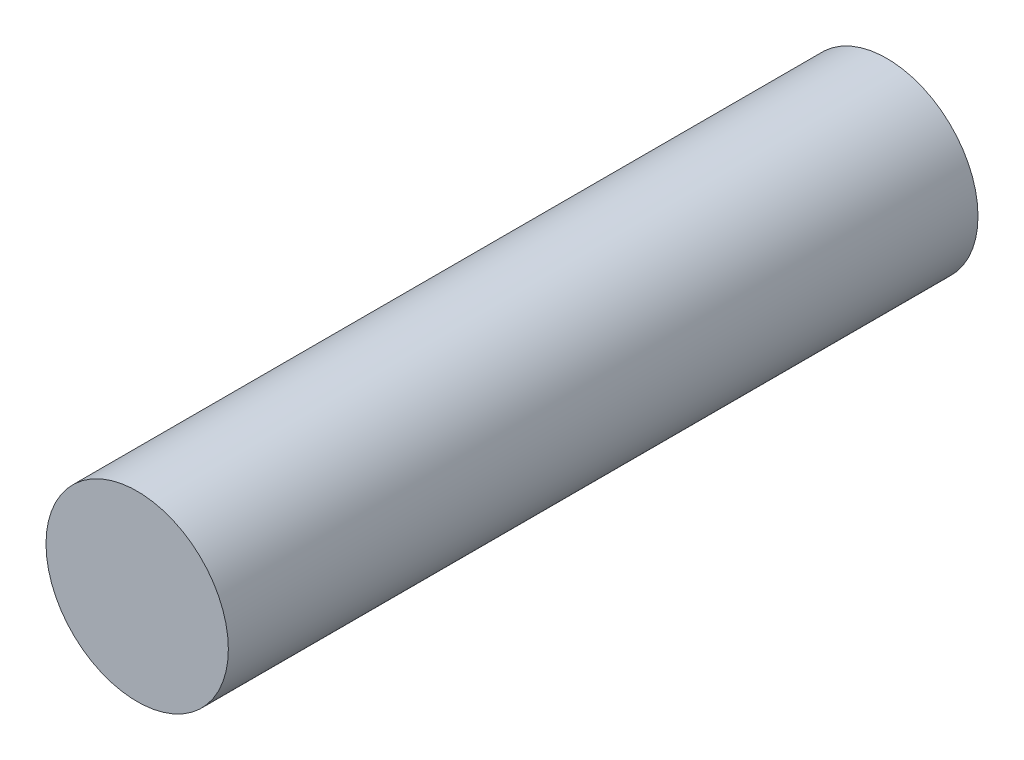
ISO-10303-21;
HEADER;
FILE_DESCRIPTION(('STEP AP214'),'2;1');
FILE_NAME('part.step','',(''),(''),'','','');
FILE_SCHEMA(('AUTOMOTIVE_DESIGN { 1 0 10303 214 1 1 1 1 }'));
ENDSEC;
DATA;
#1=APPLICATION_CONTEXT('core data for automotive mechanical design processes');
#2=APPLICATION_PROTOCOL_DEFINITION('international standard','automotive_design',2000,#1);
#3=PRODUCT_CONTEXT('',#1,'mechanical');
#4=PRODUCT('Part','Part','',(#3));
#5=PRODUCT_RELATED_PRODUCT_CATEGORY('part','',(#4));
#6=PRODUCT_DEFINITION_FORMATION('','',#4);
#7=PRODUCT_DEFINITION_CONTEXT('part definition',#1,'design');
#8=PRODUCT_DEFINITION('design','',#6,#7);
#9=PRODUCT_DEFINITION_SHAPE('','',#8);
#10=(LENGTH_UNIT() NAMED_UNIT(*) SI_UNIT(.MILLI.,.METRE.));
#11=(NAMED_UNIT(*) PLANE_ANGLE_UNIT() SI_UNIT($,.RADIAN.));
#12=(NAMED_UNIT(*) SI_UNIT($,.STERADIAN.) SOLID_ANGLE_UNIT());
#13=UNCERTAINTY_MEASURE_WITH_UNIT(LENGTH_MEASURE(1.E-05),#10,'distance_accuracy_value','');
#14=(GEOMETRIC_REPRESENTATION_CONTEXT(3) GLOBAL_UNCERTAINTY_ASSIGNED_CONTEXT((#13)) GLOBAL_UNIT_ASSIGNED_CONTEXT((#10,
#11,#12)) REPRESENTATION_CONTEXT('',''));
#15=CARTESIAN_POINT('',(0.,0.,0.));
#16=DIRECTION('',(0.,0.,1.));
#17=DIRECTION('',(1.,0.,0.));
#18=AXIS2_PLACEMENT_3D('',#15,#16,#17);
#19=CARTESIAN_POINT('',(0.,0.,18.5));
#20=DIRECTION('',(0.,0.,-1.));
#21=DIRECTION('',(-1.,0.,0.));
#22=AXIS2_PLACEMENT_3D('',#19,#20,#21);
#23=CYLINDRICAL_SURFACE('',#22,2.25);
#24=CARTESIAN_POINT('',(0.,0.,18.5));
#25=DIRECTION('',(0.,0.,1.));
#26=DIRECTION('',(1.,0.,0.));
#27=AXIS2_PLACEMENT_3D('',#24,#25,#26);
#28=CIRCLE('',#27,2.25);
#29=CARTESIAN_POINT('',(2.25,0.,18.5));
#30=VERTEX_POINT('',#29);
#31=EDGE_CURVE('E10',#30,#30,#28,.T.);
#32=ORIENTED_EDGE('',*,*,#31,.F.);
#33=EDGE_LOOP('',(#32));
#34=FACE_BOUND('',#33,.T.);
#35=CARTESIAN_POINT('',(0.,0.,0.));
#36=DIRECTION('',(0.,0.,1.));
#37=DIRECTION('',(1.,0.,0.));
#38=AXIS2_PLACEMENT_3D('',#35,#36,#37);
#39=CIRCLE('',#38,2.25);
#40=CARTESIAN_POINT('',(2.25,0.,0.));
#41=VERTEX_POINT('',#40);
#42=EDGE_CURVE('E38',#41,#41,#39,.T.);
#43=ORIENTED_EDGE('',*,*,#42,.T.);
#44=EDGE_LOOP('',(#43));
#45=FACE_BOUND('',#44,.T.);
#46=ADVANCED_FACE('F35',(#34,#45),#23,.T.);
#47=CARTESIAN_POINT('',(0.,0.,18.5));
#48=DIRECTION('',(0.,0.,1.));
#49=DIRECTION('',(1.,0.,0.));
#50=AXIS2_PLACEMENT_3D('',#47,#48,#49);
#51=PLANE('',#50);
#52=ORIENTED_EDGE('',*,*,#31,.T.);
#53=EDGE_LOOP('',(#52));
#54=FACE_BOUND('',#53,.T.);
#55=ADVANCED_FACE('F50',(#54),#51,.T.);
#56=CARTESIAN_POINT('',(0.,0.,0.));
#57=DIRECTION('',(0.,0.,1.));
#58=DIRECTION('',(1.,0.,0.));
#59=AXIS2_PLACEMENT_3D('',#56,#57,#58);
#60=PLANE('',#59);
#61=ORIENTED_EDGE('',*,*,#42,.F.);
#62=EDGE_LOOP('',(#61));
#63=FACE_BOUND('',#62,.T.);
#64=ADVANCED_FACE('F48',(#63),#60,.F.);
#65=CLOSED_SHELL('',(#46,#55,#64));
#66=MANIFOLD_SOLID_BREP('B2',#65);
#67=ADVANCED_BREP_SHAPE_REPRESENTATION('',(#18,#66),#14);
#68=SHAPE_DEFINITION_REPRESENTATION(#9,#67);
ENDSEC;
END-ISO-10303-21;
